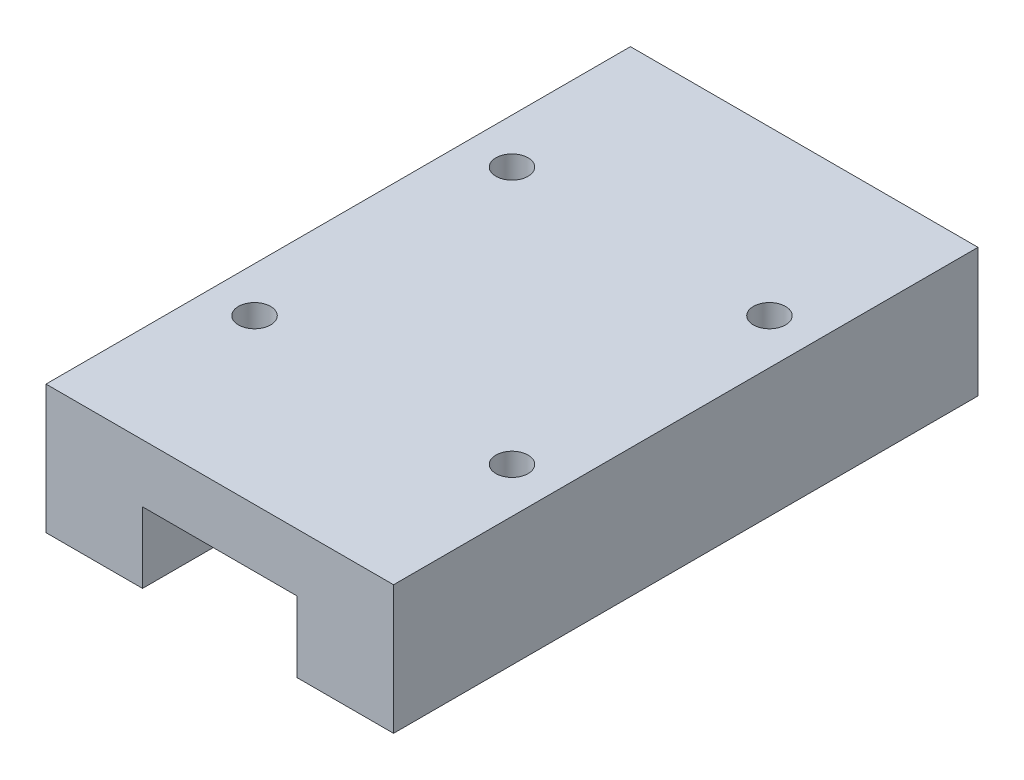
ISO-10303-21;
HEADER;
FILE_DESCRIPTION(('STEP AP214'),'2;1');
FILE_NAME('part.step','',(''),(''),'','','');
FILE_SCHEMA(('AUTOMOTIVE_DESIGN { 1 0 10303 214 1 1 1 1 }'));
ENDSEC;
DATA;
#1=APPLICATION_CONTEXT('core data for automotive mechanical design processes');
#2=APPLICATION_PROTOCOL_DEFINITION('international standard','automotive_design',2000,#1);
#3=PRODUCT_CONTEXT('',#1,'mechanical');
#4=PRODUCT('Part','Part','',(#3));
#5=PRODUCT_RELATED_PRODUCT_CATEGORY('part','',(#4));
#6=PRODUCT_DEFINITION_FORMATION('','',#4);
#7=PRODUCT_DEFINITION_CONTEXT('part definition',#1,'design');
#8=PRODUCT_DEFINITION('design','',#6,#7);
#9=PRODUCT_DEFINITION_SHAPE('','',#8);
#10=(LENGTH_UNIT() NAMED_UNIT(*) SI_UNIT(.MILLI.,.METRE.));
#11=(NAMED_UNIT(*) PLANE_ANGLE_UNIT() SI_UNIT($,.RADIAN.));
#12=(NAMED_UNIT(*) SI_UNIT($,.STERADIAN.) SOLID_ANGLE_UNIT());
#13=UNCERTAINTY_MEASURE_WITH_UNIT(LENGTH_MEASURE(1.E-05),#10,'distance_accuracy_value','');
#14=(GEOMETRIC_REPRESENTATION_CONTEXT(3) GLOBAL_UNCERTAINTY_ASSIGNED_CONTEXT((#13)) GLOBAL_UNIT_ASSIGNED_CONTEXT((#10,
#11,#12)) REPRESENTATION_CONTEXT('',''));
#15=CARTESIAN_POINT('',(0.,0.,0.));
#16=DIRECTION('',(0.,0.,1.));
#17=DIRECTION('',(1.,0.,0.));
#18=AXIS2_PLACEMENT_3D('',#15,#16,#17);
#19=CARTESIAN_POINT('',(-13.5,12.5068965517241,22.7));
#20=DIRECTION('',(1.,0.,0.));
#21=DIRECTION('',(0.,1.,0.));
#22=AXIS2_PLACEMENT_3D('',#19,#20,#21);
#23=PLANE('',#22);
#24=DIRECTION('',(0.,-1.,0.));
#25=VECTOR('',#24,1.);
#26=CARTESIAN_POINT('',(-13.5,12.5068965517241,-22.7));
#27=LINE('',#26,#25);
#28=CARTESIAN_POINT('',(-13.5,12.5068965517241,-22.7));
#29=VERTEX_POINT('',#28);
#30=CARTESIAN_POINT('',(-13.5,2.50689655172414,-22.7));
#31=VERTEX_POINT('',#30);
#32=EDGE_CURVE('E137',#29,#31,#27,.T.);
#33=ORIENTED_EDGE('',*,*,#32,.T.);
#34=DIRECTION('',(0.,0.,-1.));
#35=VECTOR('',#34,1.);
#36=CARTESIAN_POINT('',(-13.5,2.50689655172414,22.7));
#37=LINE('',#36,#35);
#38=CARTESIAN_POINT('',(-13.5,2.50689655172414,22.7));
#39=VERTEX_POINT('',#38);
#40=EDGE_CURVE('E11',#39,#31,#37,.T.);
#41=ORIENTED_EDGE('',*,*,#40,.F.);
#42=DIRECTION('',(0.,-1.,0.));
#43=VECTOR('',#42,1.);
#44=CARTESIAN_POINT('',(-13.5,12.5068965517241,22.7));
#45=LINE('',#44,#43);
#46=CARTESIAN_POINT('',(-13.5,12.5068965517241,22.7));
#47=VERTEX_POINT('',#46);
#48=EDGE_CURVE('E152',#47,#39,#45,.T.);
#49=ORIENTED_EDGE('',*,*,#48,.F.);
#50=DIRECTION('',(0.,0.,-1.));
#51=VECTOR('',#50,1.);
#52=CARTESIAN_POINT('',(-13.5,12.5068965517241,22.7));
#53=LINE('',#52,#51);
#54=EDGE_CURVE('E133',#47,#29,#53,.T.);
#55=ORIENTED_EDGE('',*,*,#54,.T.);
#56=EDGE_LOOP('',(#33,#41,#49,#55));
#57=FACE_BOUND('',#56,.T.);
#58=ADVANCED_FACE('F41',(#57),#23,.F.);
#59=CARTESIAN_POINT('',(-13.5,2.50689655172414,22.7));
#60=DIRECTION('',(0.,1.,0.));
#61=DIRECTION('',(-1.,0.,0.));
#62=AXIS2_PLACEMENT_3D('',#59,#60,#61);
#63=PLANE('',#62);
#64=DIRECTION('',(1.,0.,0.));
#65=VECTOR('',#64,1.);
#66=CARTESIAN_POINT('',(-13.5,2.50689655172414,-22.7));
#67=LINE('',#66,#65);
#68=CARTESIAN_POINT('',(-6.,2.50689655172414,-22.7));
#69=VERTEX_POINT('',#68);
#70=EDGE_CURVE('E140',#31,#69,#67,.T.);
#71=ORIENTED_EDGE('',*,*,#70,.T.);
#72=DIRECTION('',(0.,0.,-1.));
#73=VECTOR('',#72,1.);
#74=CARTESIAN_POINT('',(-6.,2.50689655172414,22.7));
#75=LINE('',#74,#73);
#76=CARTESIAN_POINT('',(-6.,2.50689655172414,22.7));
#77=VERTEX_POINT('',#76);
#78=EDGE_CURVE('E49',#77,#69,#75,.T.);
#79=ORIENTED_EDGE('',*,*,#78,.F.);
#80=DIRECTION('',(1.,0.,0.));
#81=VECTOR('',#80,1.);
#82=CARTESIAN_POINT('',(-13.5,2.50689655172414,22.7));
#83=LINE('',#82,#81);
#84=EDGE_CURVE('E100',#39,#77,#83,.T.);
#85=ORIENTED_EDGE('',*,*,#84,.F.);
#86=ORIENTED_EDGE('',*,*,#40,.T.);
#87=EDGE_LOOP('',(#71,#79,#85,#86));
#88=FACE_BOUND('',#87,.T.);
#89=ADVANCED_FACE('F233',(#88),#63,.F.);
#90=CARTESIAN_POINT('',(-6.,2.50689655172414,22.7));
#91=DIRECTION('',(-1.,0.,0.));
#92=DIRECTION('',(0.,0.,1.));
#93=AXIS2_PLACEMENT_3D('',#90,#91,#92);
#94=PLANE('',#93);
#95=DIRECTION('',(0.,1.,0.));
#96=VECTOR('',#95,1.);
#97=CARTESIAN_POINT('',(-6.,2.50689655172414,-22.7));
#98=LINE('',#97,#96);
#99=CARTESIAN_POINT('',(-6.,8.,-22.7));
#100=VERTEX_POINT('',#99);
#101=EDGE_CURVE('E143',#69,#100,#98,.T.);
#102=ORIENTED_EDGE('',*,*,#101,.T.);
#103=DIRECTION('',(0.,0.,-1.));
#104=VECTOR('',#103,1.);
#105=CARTESIAN_POINT('',(-6.,8.,22.7));
#106=LINE('',#105,#104);
#107=CARTESIAN_POINT('',(-6.,8.,22.7));
#108=VERTEX_POINT('',#107);
#109=EDGE_CURVE('E159',#108,#100,#106,.T.);
#110=ORIENTED_EDGE('',*,*,#109,.F.);
#111=DIRECTION('',(0.,1.,0.));
#112=VECTOR('',#111,1.);
#113=CARTESIAN_POINT('',(-6.,2.50689655172414,22.7));
#114=LINE('',#113,#112);
#115=EDGE_CURVE('E167',#77,#108,#114,.T.);
#116=ORIENTED_EDGE('',*,*,#115,.F.);
#117=ORIENTED_EDGE('',*,*,#78,.T.);
#118=EDGE_LOOP('',(#102,#110,#116,#117));
#119=FACE_BOUND('',#118,.T.);
#120=ADVANCED_FACE('F165',(#119),#94,.F.);
#121=CARTESIAN_POINT('',(-6.,8.,22.7));
#122=DIRECTION('',(0.,1.,0.));
#123=DIRECTION('',(0.,0.,1.));
#124=AXIS2_PLACEMENT_3D('',#121,#122,#123);
#125=PLANE('',#124);
#126=DIRECTION('',(1.,0.,0.));
#127=VECTOR('',#126,1.);
#128=CARTESIAN_POINT('',(-6.,8.,-22.7));
#129=LINE('',#128,#127);
#130=CARTESIAN_POINT('',(6.,8.,-22.7));
#131=VERTEX_POINT('',#130);
#132=EDGE_CURVE('E145',#100,#131,#129,.T.);
#133=ORIENTED_EDGE('',*,*,#132,.T.);
#134=DIRECTION('',(0.,0.,-1.));
#135=VECTOR('',#134,1.);
#136=CARTESIAN_POINT('',(6.,8.,22.7));
#137=LINE('',#136,#135);
#138=CARTESIAN_POINT('',(6.,8.,22.7));
#139=VERTEX_POINT('',#138);
#140=EDGE_CURVE('E156',#139,#131,#137,.T.);
#141=ORIENTED_EDGE('',*,*,#140,.F.);
#142=DIRECTION('',(1.,0.,0.));
#143=VECTOR('',#142,1.);
#144=CARTESIAN_POINT('',(-6.,8.,22.7));
#145=LINE('',#144,#143);
#146=EDGE_CURVE('E179',#108,#139,#145,.T.);
#147=ORIENTED_EDGE('',*,*,#146,.F.);
#148=ORIENTED_EDGE('',*,*,#109,.T.);
#149=EDGE_LOOP('',(#133,#141,#147,#148));
#150=FACE_BOUND('',#149,.T.);
#151=ADVANCED_FACE('F175',(#150),#125,.F.);
#152=CARTESIAN_POINT('',(6.,8.,22.7));
#153=DIRECTION('',(1.,0.,0.));
#154=DIRECTION('',(0.,1.,0.));
#155=AXIS2_PLACEMENT_3D('',#152,#153,#154);
#156=PLANE('',#155);
#157=DIRECTION('',(0.,-1.,0.));
#158=VECTOR('',#157,1.);
#159=CARTESIAN_POINT('',(6.,8.,-22.7));
#160=LINE('',#159,#158);
#161=CARTESIAN_POINT('',(6.,2.50689655172414,-22.7));
#162=VERTEX_POINT('',#161);
#163=EDGE_CURVE('E147',#131,#162,#160,.T.);
#164=ORIENTED_EDGE('',*,*,#163,.T.);
#165=DIRECTION('',(0.,0.,-1.));
#166=VECTOR('',#165,1.);
#167=CARTESIAN_POINT('',(6.,2.50689655172414,22.7));
#168=LINE('',#167,#166);
#169=CARTESIAN_POINT('',(6.,2.50689655172414,22.7));
#170=VERTEX_POINT('',#169);
#171=EDGE_CURVE('E128',#170,#162,#168,.T.);
#172=ORIENTED_EDGE('',*,*,#171,.F.);
#173=DIRECTION('',(0.,-1.,0.));
#174=VECTOR('',#173,1.);
#175=CARTESIAN_POINT('',(6.,8.,22.7));
#176=LINE('',#175,#174);
#177=EDGE_CURVE('E119',#139,#170,#176,.T.);
#178=ORIENTED_EDGE('',*,*,#177,.F.);
#179=ORIENTED_EDGE('',*,*,#140,.T.);
#180=EDGE_LOOP('',(#164,#172,#178,#179));
#181=FACE_BOUND('',#180,.T.);
#182=ADVANCED_FACE('F178',(#181),#156,.F.);
#183=CARTESIAN_POINT('',(6.,2.50689655172414,22.7));
#184=DIRECTION('',(0.,1.,0.));
#185=DIRECTION('',(0.,0.,1.));
#186=AXIS2_PLACEMENT_3D('',#183,#184,#185);
#187=PLANE('',#186);
#188=DIRECTION('',(1.,0.,0.));
#189=VECTOR('',#188,1.);
#190=CARTESIAN_POINT('',(6.,2.50689655172414,-22.7));
#191=LINE('',#190,#189);
#192=CARTESIAN_POINT('',(13.5,2.50689655172414,-22.7));
#193=VERTEX_POINT('',#192);
#194=EDGE_CURVE('E127',#162,#193,#191,.T.);
#195=ORIENTED_EDGE('',*,*,#194,.T.);
#196=DIRECTION('',(0.,0.,-1.));
#197=VECTOR('',#196,1.);
#198=CARTESIAN_POINT('',(13.5,2.50689655172414,22.7));
#199=LINE('',#198,#197);
#200=CARTESIAN_POINT('',(13.5,2.50689655172414,22.7));
#201=VERTEX_POINT('',#200);
#202=EDGE_CURVE('E124',#201,#193,#199,.T.);
#203=ORIENTED_EDGE('',*,*,#202,.F.);
#204=DIRECTION('',(1.,0.,0.));
#205=VECTOR('',#204,1.);
#206=CARTESIAN_POINT('',(6.,2.50689655172414,22.7));
#207=LINE('',#206,#205);
#208=EDGE_CURVE('E113',#170,#201,#207,.T.);
#209=ORIENTED_EDGE('',*,*,#208,.F.);
#210=ORIENTED_EDGE('',*,*,#171,.T.);
#211=EDGE_LOOP('',(#195,#203,#209,#210));
#212=FACE_BOUND('',#211,.T.);
#213=ADVANCED_FACE('F125',(#212),#187,.F.);
#214=CARTESIAN_POINT('',(13.5,2.50689655172414,22.7));
#215=DIRECTION('',(-1.,0.,0.));
#216=DIRECTION('',(0.,0.,1.));
#217=AXIS2_PLACEMENT_3D('',#214,#215,#216);
#218=PLANE('',#217);
#219=DIRECTION('',(0.,1.,0.));
#220=VECTOR('',#219,1.);
#221=CARTESIAN_POINT('',(13.5,2.50689655172414,-22.7));
#222=LINE('',#221,#220);
#223=CARTESIAN_POINT('',(13.5,12.5068965517241,-22.7));
#224=VERTEX_POINT('',#223);
#225=EDGE_CURVE('E86',#193,#224,#222,.T.);
#226=ORIENTED_EDGE('',*,*,#225,.T.);
#227=DIRECTION('',(0.,0.,-1.));
#228=VECTOR('',#227,1.);
#229=CARTESIAN_POINT('',(13.5,12.5068965517241,22.7));
#230=LINE('',#229,#228);
#231=CARTESIAN_POINT('',(13.5,12.5068965517241,22.7));
#232=VERTEX_POINT('',#231);
#233=EDGE_CURVE('E129',#232,#224,#230,.T.);
#234=ORIENTED_EDGE('',*,*,#233,.F.);
#235=DIRECTION('',(0.,1.,0.));
#236=VECTOR('',#235,1.);
#237=CARTESIAN_POINT('',(13.5,2.50689655172414,22.7));
#238=LINE('',#237,#236);
#239=EDGE_CURVE('E117',#201,#232,#238,.T.);
#240=ORIENTED_EDGE('',*,*,#239,.F.);
#241=ORIENTED_EDGE('',*,*,#202,.T.);
#242=EDGE_LOOP('',(#226,#234,#240,#241));
#243=FACE_BOUND('',#242,.T.);
#244=ADVANCED_FACE('F131',(#243),#218,.F.);
#245=CARTESIAN_POINT('',(13.5,12.5068965517241,22.7));
#246=DIRECTION('',(0.,-1.,0.));
#247=DIRECTION('',(1.,0.,0.));
#248=AXIS2_PLACEMENT_3D('',#245,#246,#247);
#249=PLANE('',#248);
#250=CARTESIAN_POINT('',(9.99999999999999,12.5068965517241,-10.));
#251=DIRECTION('',(0.,1.,0.));
#252=DIRECTION('',(-1.,0.,0.));
#253=AXIS2_PLACEMENT_3D('',#250,#251,#252);
#254=CIRCLE('',#253,1.25);
#255=CARTESIAN_POINT('',(8.75,12.5068965517241,-10.));
#256=VERTEX_POINT('',#255);
#257=EDGE_CURVE('E188',#256,#256,#254,.T.);
#258=ORIENTED_EDGE('',*,*,#257,.F.);
#259=EDGE_LOOP('',(#258));
#260=FACE_BOUND('',#259,.T.);
#261=CARTESIAN_POINT('',(-10.,12.5068965517241,10.));
#262=DIRECTION('',(0.,1.,0.));
#263=DIRECTION('',(-1.,0.,0.));
#264=AXIS2_PLACEMENT_3D('',#261,#262,#263);
#265=CIRCLE('',#264,1.25);
#266=CARTESIAN_POINT('',(-11.25,12.5068965517241,10.));
#267=VERTEX_POINT('',#266);
#268=EDGE_CURVE('E194',#267,#267,#265,.T.);
#269=ORIENTED_EDGE('',*,*,#268,.F.);
#270=EDGE_LOOP('',(#269));
#271=FACE_BOUND('',#270,.T.);
#272=CARTESIAN_POINT('',(10.,12.5068965517241,10.));
#273=DIRECTION('',(0.,1.,0.));
#274=DIRECTION('',(-1.,0.,0.));
#275=AXIS2_PLACEMENT_3D('',#272,#273,#274);
#276=CIRCLE('',#275,1.25);
#277=CARTESIAN_POINT('',(8.75,12.5068965517241,10.));
#278=VERTEX_POINT('',#277);
#279=EDGE_CURVE('E195',#278,#278,#276,.T.);
#280=ORIENTED_EDGE('',*,*,#279,.F.);
#281=EDGE_LOOP('',(#280));
#282=FACE_BOUND('',#281,.T.);
#283=CARTESIAN_POINT('',(-10.,12.5068965517241,-10.));
#284=DIRECTION('',(0.,1.,0.));
#285=DIRECTION('',(-1.,0.,0.));
#286=AXIS2_PLACEMENT_3D('',#283,#284,#285);
#287=CIRCLE('',#286,1.25);
#288=CARTESIAN_POINT('',(-11.25,12.5068965517241,-10.));
#289=VERTEX_POINT('',#288);
#290=EDGE_CURVE('E185',#289,#289,#287,.T.);
#291=ORIENTED_EDGE('',*,*,#290,.F.);
#292=EDGE_LOOP('',(#291));
#293=FACE_BOUND('',#292,.T.);
#294=DIRECTION('',(-1.,0.,0.));
#295=VECTOR('',#294,1.);
#296=CARTESIAN_POINT('',(13.5,12.5068965517241,-22.7));
#297=LINE('',#296,#295);
#298=EDGE_CURVE('E92',#224,#29,#297,.T.);
#299=ORIENTED_EDGE('',*,*,#298,.T.);
#300=ORIENTED_EDGE('',*,*,#54,.F.);
#301=DIRECTION('',(-1.,0.,0.));
#302=VECTOR('',#301,1.);
#303=CARTESIAN_POINT('',(13.5,12.5068965517241,22.7));
#304=LINE('',#303,#302);
#305=EDGE_CURVE('E57',#232,#47,#304,.T.);
#306=ORIENTED_EDGE('',*,*,#305,.F.);
#307=ORIENTED_EDGE('',*,*,#233,.T.);
#308=EDGE_LOOP('',(#299,#300,#306,#307));
#309=FACE_BOUND('',#308,.T.);
#310=ADVANCED_FACE('F211',(#260,#271,#282,#293,#309),#249,.F.);
#311=CARTESIAN_POINT('',(0.,0.,22.7));
#312=DIRECTION('',(0.,0.,1.));
#313=DIRECTION('',(1.,0.,0.));
#314=AXIS2_PLACEMENT_3D('',#311,#312,#313);
#315=PLANE('',#314);
#316=ORIENTED_EDGE('',*,*,#48,.T.);
#317=ORIENTED_EDGE('',*,*,#84,.T.);
#318=ORIENTED_EDGE('',*,*,#115,.T.);
#319=ORIENTED_EDGE('',*,*,#146,.T.);
#320=ORIENTED_EDGE('',*,*,#177,.T.);
#321=ORIENTED_EDGE('',*,*,#208,.T.);
#322=ORIENTED_EDGE('',*,*,#239,.T.);
#323=ORIENTED_EDGE('',*,*,#305,.T.);
#324=EDGE_LOOP('',(#316,#317,#318,#319,#320,#321,#322,#323));
#325=FACE_BOUND('',#324,.T.);
#326=ADVANCED_FACE('F115',(#325),#315,.T.);
#327=CARTESIAN_POINT('',(0.,0.,-22.7));
#328=DIRECTION('',(0.,0.,1.));
#329=DIRECTION('',(1.,0.,0.));
#330=AXIS2_PLACEMENT_3D('',#327,#328,#329);
#331=PLANE('',#330);
#332=ORIENTED_EDGE('',*,*,#32,.F.);
#333=ORIENTED_EDGE('',*,*,#298,.F.);
#334=ORIENTED_EDGE('',*,*,#225,.F.);
#335=ORIENTED_EDGE('',*,*,#194,.F.);
#336=ORIENTED_EDGE('',*,*,#163,.F.);
#337=ORIENTED_EDGE('',*,*,#132,.F.);
#338=ORIENTED_EDGE('',*,*,#101,.F.);
#339=ORIENTED_EDGE('',*,*,#70,.F.);
#340=EDGE_LOOP('',(#332,#333,#334,#335,#336,#337,#338,#339));
#341=FACE_BOUND('',#340,.T.);
#342=ADVANCED_FACE('F171',(#341),#331,.F.);
#343=CARTESIAN_POINT('',(-10.,9.00689655172414,-10.));
#344=DIRECTION('',(0.,1.,0.));
#345=DIRECTION('',(-1.,0.,0.));
#346=AXIS2_PLACEMENT_3D('',#343,#344,#345);
#347=CYLINDRICAL_SURFACE('',#346,1.25);
#348=CARTESIAN_POINT('',(-10.,9.00689655172414,-10.));
#349=DIRECTION('',(0.,1.,0.));
#350=DIRECTION('',(-1.,0.,0.));
#351=AXIS2_PLACEMENT_3D('',#348,#349,#350);
#352=CIRCLE('',#351,1.25);
#353=CARTESIAN_POINT('',(-11.25,9.00689655172414,-10.));
#354=VERTEX_POINT('',#353);
#355=EDGE_CURVE('E141',#354,#354,#352,.T.);
#356=ORIENTED_EDGE('',*,*,#355,.F.);
#357=EDGE_LOOP('',(#356));
#358=FACE_BOUND('',#357,.T.);
#359=ORIENTED_EDGE('',*,*,#290,.T.);
#360=EDGE_LOOP('',(#359));
#361=FACE_BOUND('',#360,.T.);
#362=ADVANCED_FACE('F218',(#358,#361),#347,.F.);
#363=CARTESIAN_POINT('',(-10.,9.00689655172414,-10.));
#364=DIRECTION('',(0.,1.,0.));
#365=DIRECTION('',(-1.,0.,0.));
#366=AXIS2_PLACEMENT_3D('',#363,#364,#365);
#367=PLANE('',#366);
#368=ORIENTED_EDGE('',*,*,#355,.T.);
#369=EDGE_LOOP('',(#368));
#370=FACE_BOUND('',#369,.T.);
#371=ADVANCED_FACE('F220',(#370),#367,.T.);
#372=CARTESIAN_POINT('',(10.,9.00689655172414,10.));
#373=DIRECTION('',(0.,1.,0.));
#374=DIRECTION('',(-1.,0.,0.));
#375=AXIS2_PLACEMENT_3D('',#372,#373,#374);
#376=CYLINDRICAL_SURFACE('',#375,1.25);
#377=CARTESIAN_POINT('',(10.,9.00689655172414,10.));
#378=DIRECTION('',(0.,1.,0.));
#379=DIRECTION('',(-1.,0.,0.));
#380=AXIS2_PLACEMENT_3D('',#377,#378,#379);
#381=CIRCLE('',#380,1.25);
#382=CARTESIAN_POINT('',(8.75,9.00689655172414,10.));
#383=VERTEX_POINT('',#382);
#384=EDGE_CURVE('E203',#383,#383,#381,.T.);
#385=ORIENTED_EDGE('',*,*,#384,.F.);
#386=EDGE_LOOP('',(#385));
#387=FACE_BOUND('',#386,.T.);
#388=ORIENTED_EDGE('',*,*,#279,.T.);
#389=EDGE_LOOP('',(#388));
#390=FACE_BOUND('',#389,.T.);
#391=ADVANCED_FACE('F209',(#387,#390),#376,.F.);
#392=CARTESIAN_POINT('',(10.,9.00689655172414,10.));
#393=DIRECTION('',(0.,1.,0.));
#394=DIRECTION('',(-1.,0.,0.));
#395=AXIS2_PLACEMENT_3D('',#392,#393,#394);
#396=PLANE('',#395);
#397=ORIENTED_EDGE('',*,*,#384,.T.);
#398=EDGE_LOOP('',(#397));
#399=FACE_BOUND('',#398,.T.);
#400=ADVANCED_FACE('F323',(#399),#396,.T.);
#401=CARTESIAN_POINT('',(-10.,9.00689655172414,10.));
#402=DIRECTION('',(0.,1.,0.));
#403=DIRECTION('',(-1.,0.,0.));
#404=AXIS2_PLACEMENT_3D('',#401,#402,#403);
#405=CYLINDRICAL_SURFACE('',#404,1.25);
#406=CARTESIAN_POINT('',(-10.,9.00689655172414,10.));
#407=DIRECTION('',(0.,1.,0.));
#408=DIRECTION('',(-1.,0.,0.));
#409=AXIS2_PLACEMENT_3D('',#406,#407,#408);
#410=CIRCLE('',#409,1.25);
#411=CARTESIAN_POINT('',(-11.25,9.00689655172414,10.));
#412=VERTEX_POINT('',#411);
#413=EDGE_CURVE('E191',#412,#412,#410,.T.);
#414=ORIENTED_EDGE('',*,*,#413,.F.);
#415=EDGE_LOOP('',(#414));
#416=FACE_BOUND('',#415,.T.);
#417=ORIENTED_EDGE('',*,*,#268,.T.);
#418=EDGE_LOOP('',(#417));
#419=FACE_BOUND('',#418,.T.);
#420=ADVANCED_FACE('F332',(#416,#419),#405,.F.);
#421=CARTESIAN_POINT('',(-10.,9.00689655172414,10.));
#422=DIRECTION('',(0.,1.,0.));
#423=DIRECTION('',(-1.,0.,0.));
#424=AXIS2_PLACEMENT_3D('',#421,#422,#423);
#425=PLANE('',#424);
#426=ORIENTED_EDGE('',*,*,#413,.T.);
#427=EDGE_LOOP('',(#426));
#428=FACE_BOUND('',#427,.T.);
#429=ADVANCED_FACE('F341',(#428),#425,.T.);
#430=CARTESIAN_POINT('',(9.99999999999999,9.00689655172414,-10.));
#431=DIRECTION('',(0.,1.,0.));
#432=DIRECTION('',(-1.,0.,0.));
#433=AXIS2_PLACEMENT_3D('',#430,#431,#432);
#434=CYLINDRICAL_SURFACE('',#433,1.25);
#435=CARTESIAN_POINT('',(9.99999999999999,9.00689655172414,-10.));
#436=DIRECTION('',(0.,1.,0.));
#437=DIRECTION('',(-1.,0.,0.));
#438=AXIS2_PLACEMENT_3D('',#435,#436,#437);
#439=CIRCLE('',#438,1.25);
#440=CARTESIAN_POINT('',(8.75,9.00689655172414,-10.));
#441=VERTEX_POINT('',#440);
#442=EDGE_CURVE('E198',#441,#441,#439,.T.);
#443=ORIENTED_EDGE('',*,*,#442,.F.);
#444=EDGE_LOOP('',(#443));
#445=FACE_BOUND('',#444,.T.);
#446=ORIENTED_EDGE('',*,*,#257,.T.);
#447=EDGE_LOOP('',(#446));
#448=FACE_BOUND('',#447,.T.);
#449=ADVANCED_FACE('F350',(#445,#448),#434,.F.);
#450=CARTESIAN_POINT('',(9.99999999999999,9.00689655172414,-10.));
#451=DIRECTION('',(0.,1.,0.));
#452=DIRECTION('',(-1.,0.,0.));
#453=AXIS2_PLACEMENT_3D('',#450,#451,#452);
#454=PLANE('',#453);
#455=ORIENTED_EDGE('',*,*,#442,.T.);
#456=EDGE_LOOP('',(#455));
#457=FACE_BOUND('',#456,.T.);
#458=ADVANCED_FACE('F359',(#457),#454,.T.);
#459=CLOSED_SHELL('',(#58,#89,#120,#151,#182,#213,#244,#310,#326,#342,#362,#371,#391,#400,#420,
#429,#449,#458));
#460=MANIFOLD_SOLID_BREP('B2',#459);
#461=ADVANCED_BREP_SHAPE_REPRESENTATION('',(#18,#460),#14);
#462=SHAPE_DEFINITION_REPRESENTATION(#9,#461);
ENDSEC;
END-ISO-10303-21;
